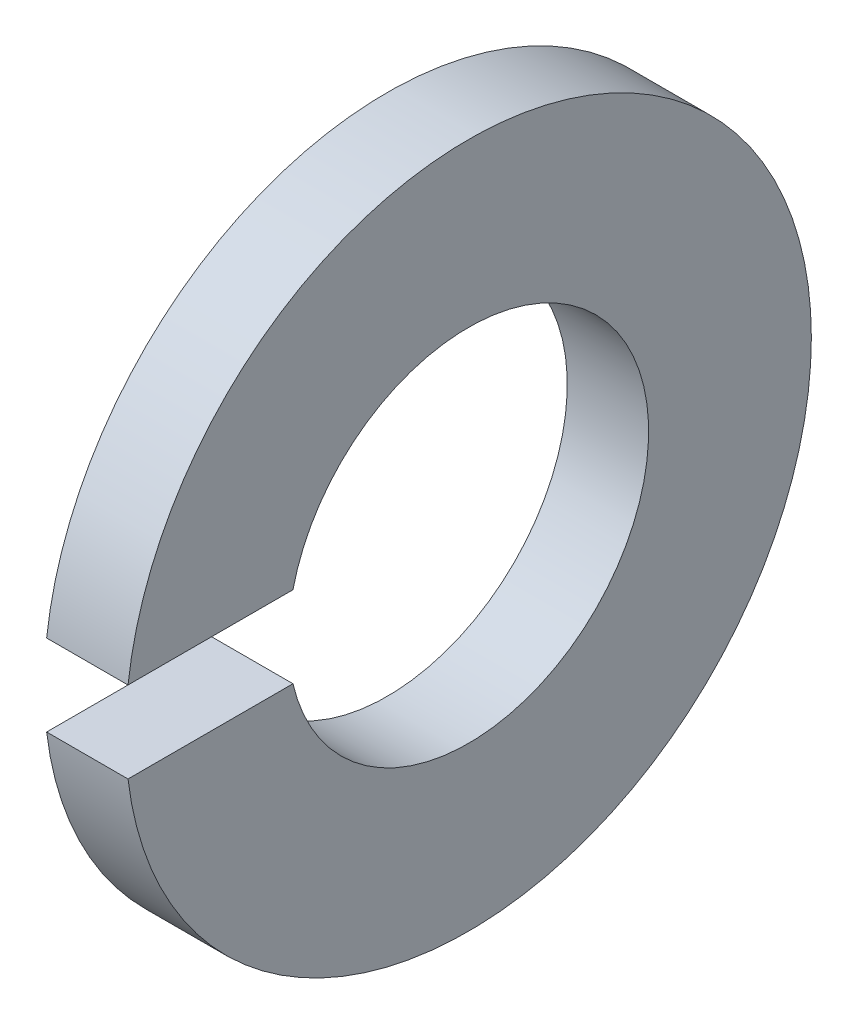
ISO-10303-21;
HEADER;
FILE_DESCRIPTION(('STEP AP214'),'2;1');
FILE_NAME('part.step','',(''),(''),'','','');
FILE_SCHEMA(('AUTOMOTIVE_DESIGN { 1 0 10303 214 1 1 1 1 }'));
ENDSEC;
DATA;
#1=APPLICATION_CONTEXT('core data for automotive mechanical design processes');
#2=APPLICATION_PROTOCOL_DEFINITION('international standard','automotive_design',2000,#1);
#3=PRODUCT_CONTEXT('',#1,'mechanical');
#4=PRODUCT('Part','Part','',(#3));
#5=PRODUCT_RELATED_PRODUCT_CATEGORY('part','',(#4));
#6=PRODUCT_DEFINITION_FORMATION('','',#4);
#7=PRODUCT_DEFINITION_CONTEXT('part definition',#1,'design');
#8=PRODUCT_DEFINITION('design','',#6,#7);
#9=PRODUCT_DEFINITION_SHAPE('','',#8);
#10=(LENGTH_UNIT() NAMED_UNIT(*) SI_UNIT(.MILLI.,.METRE.));
#11=(NAMED_UNIT(*) PLANE_ANGLE_UNIT() SI_UNIT($,.RADIAN.));
#12=(NAMED_UNIT(*) SI_UNIT($,.STERADIAN.) SOLID_ANGLE_UNIT());
#13=UNCERTAINTY_MEASURE_WITH_UNIT(LENGTH_MEASURE(1.E-05),#10,'distance_accuracy_value','');
#14=(GEOMETRIC_REPRESENTATION_CONTEXT(3) GLOBAL_UNCERTAINTY_ASSIGNED_CONTEXT((#13)) GLOBAL_UNIT_ASSIGNED_CONTEXT((#10,
#11,#12)) REPRESENTATION_CONTEXT('',''));
#15=CARTESIAN_POINT('',(0.,0.,0.));
#16=DIRECTION('',(0.,0.,1.));
#17=DIRECTION('',(1.,0.,0.));
#18=AXIS2_PLACEMENT_3D('',#15,#16,#17);
#19=CARTESIAN_POINT('',(0.,2.95,0.));
#20=DIRECTION('',(-1.,0.,0.));
#21=DIRECTION('',(0.,0.,1.));
#22=AXIS2_PLACEMENT_3D('',#19,#20,#21);
#23=PLANE('',#22);
#24=CARTESIAN_POINT('',(0.,0.,0.));
#25=DIRECTION('',(-1.,0.,0.));
#26=DIRECTION('',(0.,0.,1.));
#27=AXIS2_PLACEMENT_3D('',#24,#25,#26);
#28=CIRCLE('',#27,1.55);
#29=CARTESIAN_POINT('',(0.,0.35,1.50996688705415));
#30=VERTEX_POINT('',#29);
#31=CARTESIAN_POINT('',(0.,-0.35,1.50996688705415));
#32=VERTEX_POINT('',#31);
#33=EDGE_CURVE('E11',#30,#32,#28,.T.);
#34=ORIENTED_EDGE('',*,*,#33,.T.);
#35=DIRECTION('',(0.,0.,-1.));
#36=VECTOR('',#35,1.);
#37=CARTESIAN_POINT('',(0.,-0.35,1.50996688705415));
#38=LINE('',#37,#36);
#39=CARTESIAN_POINT('',(0.,-0.35,2.92916370317536));
#40=VERTEX_POINT('',#39);
#41=EDGE_CURVE('E97',#40,#32,#38,.T.);
#42=ORIENTED_EDGE('',*,*,#41,.F.);
#43=CARTESIAN_POINT('',(0.,0.,0.));
#44=DIRECTION('',(-1.,0.,0.));
#45=DIRECTION('',(0.,0.,1.));
#46=AXIS2_PLACEMENT_3D('',#43,#44,#45);
#47=CIRCLE('',#46,2.95);
#48=CARTESIAN_POINT('',(0.,0.35,2.92916370317536));
#49=VERTEX_POINT('',#48);
#50=EDGE_CURVE('E111',#49,#40,#47,.T.);
#51=ORIENTED_EDGE('',*,*,#50,.F.);
#52=DIRECTION('',(0.,0.,1.));
#53=VECTOR('',#52,1.);
#54=CARTESIAN_POINT('',(0.,0.35,1.50996688705415));
#55=LINE('',#54,#53);
#56=EDGE_CURVE('E58',#30,#49,#55,.T.);
#57=ORIENTED_EDGE('',*,*,#56,.F.);
#58=EDGE_LOOP('',(#34,#42,#51,#57));
#59=FACE_BOUND('',#58,.T.);
#60=ADVANCED_FACE('F40',(#59),#23,.F.);
#61=CARTESIAN_POINT('',(-0.7,0.,0.));
#62=DIRECTION('',(-1.,0.,0.));
#63=DIRECTION('',(0.,0.,1.));
#64=AXIS2_PLACEMENT_3D('',#61,#62,#63);
#65=CYLINDRICAL_SURFACE('',#64,1.55);
#66=CARTESIAN_POINT('',(-0.7,0.,0.));
#67=DIRECTION('',(-1.,0.,0.));
#68=DIRECTION('',(0.,0.,1.));
#69=AXIS2_PLACEMENT_3D('',#66,#67,#68);
#70=CIRCLE('',#69,1.55);
#71=CARTESIAN_POINT('',(-0.7,0.35,1.50996688705415));
#72=VERTEX_POINT('',#71);
#73=CARTESIAN_POINT('',(-0.7,-0.35,1.50996688705415));
#74=VERTEX_POINT('',#73);
#75=EDGE_CURVE('E48',#72,#74,#70,.T.);
#76=ORIENTED_EDGE('',*,*,#75,.T.);
#77=DIRECTION('',(1.,0.,0.));
#78=VECTOR('',#77,1.);
#79=CARTESIAN_POINT('',(-0.7,-0.35,1.50996688705415));
#80=LINE('',#79,#78);
#81=EDGE_CURVE('E116',#74,#32,#80,.T.);
#82=ORIENTED_EDGE('',*,*,#81,.T.);
#83=ORIENTED_EDGE('',*,*,#33,.F.);
#84=DIRECTION('',(1.,0.,0.));
#85=VECTOR('',#84,1.);
#86=CARTESIAN_POINT('',(-0.7,0.35,1.50996688705415));
#87=LINE('',#86,#85);
#88=EDGE_CURVE('E90',#72,#30,#87,.T.);
#89=ORIENTED_EDGE('',*,*,#88,.F.);
#90=EDGE_LOOP('',(#76,#82,#83,#89));
#91=FACE_BOUND('',#90,.T.);
#92=ADVANCED_FACE('F102',(#91),#65,.F.);
#93=CARTESIAN_POINT('',(-0.7,2.95,0.));
#94=DIRECTION('',(1.,0.,0.));
#95=DIRECTION('',(0.,0.,-1.));
#96=AXIS2_PLACEMENT_3D('',#93,#94,#95);
#97=PLANE('',#96);
#98=CARTESIAN_POINT('',(-0.7,0.,0.));
#99=DIRECTION('',(-1.,0.,0.));
#100=DIRECTION('',(0.,0.,1.));
#101=AXIS2_PLACEMENT_3D('',#98,#99,#100);
#102=CIRCLE('',#101,2.95);
#103=CARTESIAN_POINT('',(-0.7,0.35,2.92916370317536));
#104=VERTEX_POINT('',#103);
#105=CARTESIAN_POINT('',(-0.7,-0.35,2.92916370317536));
#106=VERTEX_POINT('',#105);
#107=EDGE_CURVE('E108',#104,#106,#102,.T.);
#108=ORIENTED_EDGE('',*,*,#107,.T.);
#109=DIRECTION('',(0.,0.,-1.));
#110=VECTOR('',#109,1.);
#111=CARTESIAN_POINT('',(-0.7,-0.35,1.50996688705415));
#112=LINE('',#111,#110);
#113=EDGE_CURVE('E68',#106,#74,#112,.T.);
#114=ORIENTED_EDGE('',*,*,#113,.T.);
#115=ORIENTED_EDGE('',*,*,#75,.F.);
#116=DIRECTION('',(0.,0.,1.));
#117=VECTOR('',#116,1.);
#118=CARTESIAN_POINT('',(-0.7,0.35,1.50996688705415));
#119=LINE('',#118,#117);
#120=EDGE_CURVE('E87',#72,#104,#119,.T.);
#121=ORIENTED_EDGE('',*,*,#120,.T.);
#122=EDGE_LOOP('',(#108,#114,#115,#121));
#123=FACE_BOUND('',#122,.T.);
#124=ADVANCED_FACE('F106',(#123),#97,.F.);
#125=CARTESIAN_POINT('',(-0.7,0.,0.));
#126=DIRECTION('',(-1.,0.,0.));
#127=DIRECTION('',(0.,0.,1.));
#128=AXIS2_PLACEMENT_3D('',#125,#126,#127);
#129=CYLINDRICAL_SURFACE('',#128,2.95);
#130=ORIENTED_EDGE('',*,*,#50,.T.);
#131=DIRECTION('',(1.,0.,0.));
#132=VECTOR('',#131,1.);
#133=CARTESIAN_POINT('',(-0.7,-0.35,2.92916370317536));
#134=LINE('',#133,#132);
#135=EDGE_CURVE('E120',#106,#40,#134,.T.);
#136=ORIENTED_EDGE('',*,*,#135,.F.);
#137=ORIENTED_EDGE('',*,*,#107,.F.);
#138=DIRECTION('',(1.,0.,0.));
#139=VECTOR('',#138,1.);
#140=CARTESIAN_POINT('',(-0.7,0.35,2.92916370317536));
#141=LINE('',#140,#139);
#142=EDGE_CURVE('E91',#104,#49,#141,.T.);
#143=ORIENTED_EDGE('',*,*,#142,.T.);
#144=EDGE_LOOP('',(#130,#136,#137,#143));
#145=FACE_BOUND('',#144,.T.);
#146=ADVANCED_FACE('F134',(#145),#129,.T.);
#147=CARTESIAN_POINT('',(-0.7,0.35,1.50996688705415));
#148=DIRECTION('',(0.,1.,0.));
#149=DIRECTION('',(0.,0.,1.));
#150=AXIS2_PLACEMENT_3D('',#147,#148,#149);
#151=PLANE('',#150);
#152=ORIENTED_EDGE('',*,*,#56,.T.);
#153=ORIENTED_EDGE('',*,*,#142,.F.);
#154=ORIENTED_EDGE('',*,*,#120,.F.);
#155=ORIENTED_EDGE('',*,*,#88,.T.);
#156=EDGE_LOOP('',(#152,#153,#154,#155));
#157=FACE_BOUND('',#156,.T.);
#158=ADVANCED_FACE('F89',(#157),#151,.F.);
#159=CARTESIAN_POINT('',(-0.7,-0.35,1.50996688705415));
#160=DIRECTION('',(0.,-1.,0.));
#161=DIRECTION('',(0.,0.,-1.));
#162=AXIS2_PLACEMENT_3D('',#159,#160,#161);
#163=PLANE('',#162);
#164=ORIENTED_EDGE('',*,*,#41,.T.);
#165=ORIENTED_EDGE('',*,*,#81,.F.);
#166=ORIENTED_EDGE('',*,*,#113,.F.);
#167=ORIENTED_EDGE('',*,*,#135,.T.);
#168=EDGE_LOOP('',(#164,#165,#166,#167));
#169=FACE_BOUND('',#168,.T.);
#170=ADVANCED_FACE('F130',(#169),#163,.F.);
#171=CLOSED_SHELL('',(#60,#92,#124,#146,#158,#170));
#172=MANIFOLD_SOLID_BREP('B2',#171);
#173=ADVANCED_BREP_SHAPE_REPRESENTATION('',(#18,#172),#14);
#174=SHAPE_DEFINITION_REPRESENTATION(#9,#173);
ENDSEC;
END-ISO-10303-21;
